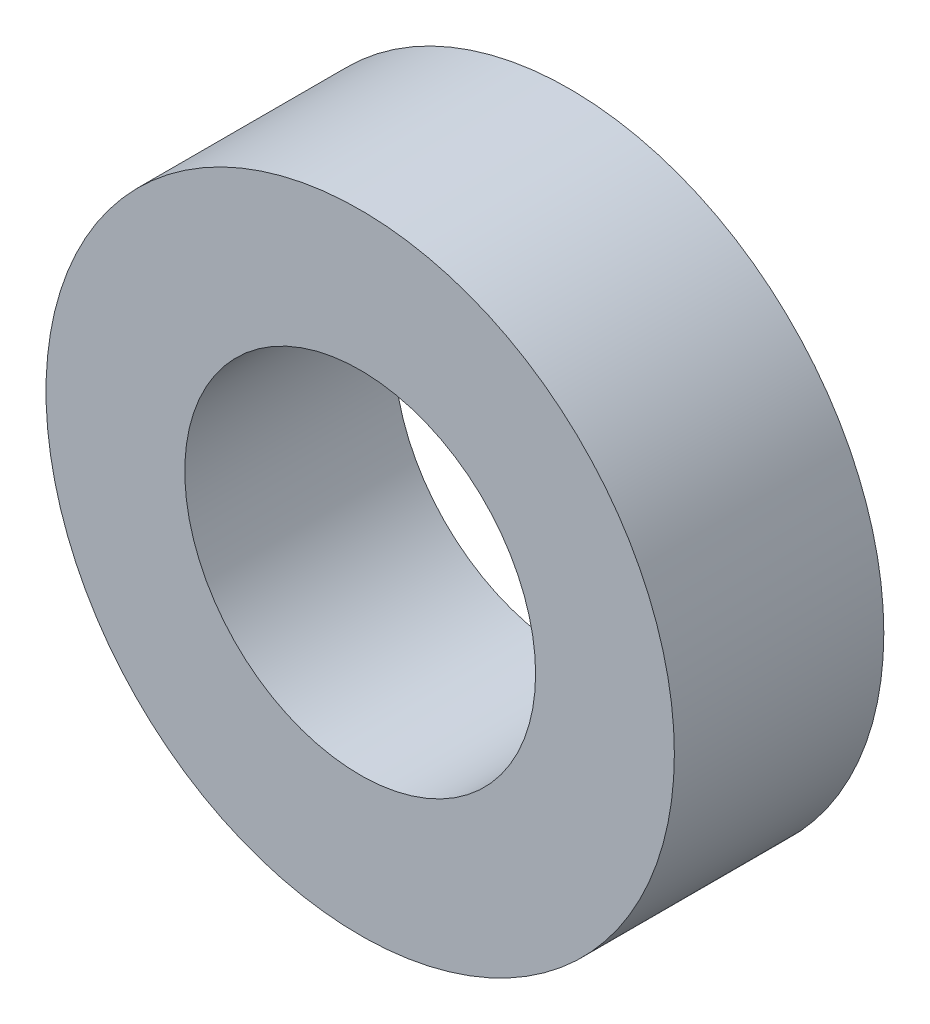
ISO-10303-21;
HEADER;
FILE_DESCRIPTION(('STEP AP214'),'2;1');
FILE_NAME('part.step','',(''),(''),'','','');
FILE_SCHEMA(('AUTOMOTIVE_DESIGN { 1 0 10303 214 1 1 1 1 }'));
ENDSEC;
DATA;
#1=APPLICATION_CONTEXT('core data for automotive mechanical design processes');
#2=APPLICATION_PROTOCOL_DEFINITION('international standard','automotive_design',2000,#1);
#3=PRODUCT_CONTEXT('',#1,'mechanical');
#4=PRODUCT('Part','Part','',(#3));
#5=PRODUCT_RELATED_PRODUCT_CATEGORY('part','',(#4));
#6=PRODUCT_DEFINITION_FORMATION('','',#4);
#7=PRODUCT_DEFINITION_CONTEXT('part definition',#1,'design');
#8=PRODUCT_DEFINITION('design','',#6,#7);
#9=PRODUCT_DEFINITION_SHAPE('','',#8);
#10=(LENGTH_UNIT() NAMED_UNIT(*) SI_UNIT(.MILLI.,.METRE.));
#11=(NAMED_UNIT(*) PLANE_ANGLE_UNIT() SI_UNIT($,.RADIAN.));
#12=(NAMED_UNIT(*) SI_UNIT($,.STERADIAN.) SOLID_ANGLE_UNIT());
#13=UNCERTAINTY_MEASURE_WITH_UNIT(LENGTH_MEASURE(1.E-05),#10,'distance_accuracy_value','');
#14=(GEOMETRIC_REPRESENTATION_CONTEXT(3) GLOBAL_UNCERTAINTY_ASSIGNED_CONTEXT((#13)) GLOBAL_UNIT_ASSIGNED_CONTEXT((#10,
#11,#12)) REPRESENTATION_CONTEXT('',''));
#15=CARTESIAN_POINT('',(0.,0.,0.));
#16=DIRECTION('',(0.,0.,1.));
#17=DIRECTION('',(1.,0.,0.));
#18=AXIS2_PLACEMENT_3D('',#15,#16,#17);
#19=CARTESIAN_POINT('',(0.,0.,2.));
#20=DIRECTION('',(0.,0.,1.));
#21=DIRECTION('',(1.,0.,0.));
#22=AXIS2_PLACEMENT_3D('',#19,#20,#21);
#23=PLANE('',#22);
#24=CARTESIAN_POINT('',(0.,0.,2.));
#25=DIRECTION('',(0.,0.,1.));
#26=DIRECTION('',(1.,0.,0.));
#27=AXIS2_PLACEMENT_3D('',#24,#25,#26);
#28=CIRCLE('',#27,3.);
#29=CARTESIAN_POINT('',(3.,0.,2.));
#30=VERTEX_POINT('',#29);
#31=EDGE_CURVE('E10',#30,#30,#28,.T.);
#32=ORIENTED_EDGE('',*,*,#31,.T.);
#33=EDGE_LOOP('',(#32));
#34=FACE_BOUND('',#33,.T.);
#35=CARTESIAN_POINT('',(0.,0.,2.));
#36=DIRECTION('',(0.,0.,1.));
#37=DIRECTION('',(1.,0.,0.));
#38=AXIS2_PLACEMENT_3D('',#35,#36,#37);
#39=CIRCLE('',#38,1.675);
#40=CARTESIAN_POINT('',(1.675,0.,2.));
#41=VERTEX_POINT('',#40);
#42=EDGE_CURVE('E56',#41,#41,#39,.T.);
#43=ORIENTED_EDGE('',*,*,#42,.F.);
#44=EDGE_LOOP('',(#43));
#45=FACE_BOUND('',#44,.T.);
#46=ADVANCED_FACE('F43',(#34,#45),#23,.T.);
#47=CARTESIAN_POINT('',(0.,0.,0.));
#48=DIRECTION('',(0.,0.,1.));
#49=DIRECTION('',(1.,0.,0.));
#50=AXIS2_PLACEMENT_3D('',#47,#48,#49);
#51=PLANE('',#50);
#52=CARTESIAN_POINT('',(0.,0.,0.));
#53=DIRECTION('',(0.,0.,1.));
#54=DIRECTION('',(1.,0.,0.));
#55=AXIS2_PLACEMENT_3D('',#52,#53,#54);
#56=CIRCLE('',#55,3.);
#57=CARTESIAN_POINT('',(3.,0.,0.));
#58=VERTEX_POINT('',#57);
#59=EDGE_CURVE('E47',#58,#58,#56,.T.);
#60=ORIENTED_EDGE('',*,*,#59,.F.);
#61=EDGE_LOOP('',(#60));
#62=FACE_BOUND('',#61,.T.);
#63=CARTESIAN_POINT('',(0.,0.,0.));
#64=DIRECTION('',(0.,0.,1.));
#65=DIRECTION('',(1.,0.,0.));
#66=AXIS2_PLACEMENT_3D('',#63,#64,#65);
#67=CIRCLE('',#66,1.675);
#68=CARTESIAN_POINT('',(1.675,0.,0.));
#69=VERTEX_POINT('',#68);
#70=EDGE_CURVE('E58',#69,#69,#67,.T.);
#71=ORIENTED_EDGE('',*,*,#70,.T.);
#72=EDGE_LOOP('',(#71));
#73=FACE_BOUND('',#72,.T.);
#74=ADVANCED_FACE('F70',(#62,#73),#51,.F.);
#75=CARTESIAN_POINT('',(0.,0.,2.));
#76=DIRECTION('',(0.,0.,-1.));
#77=DIRECTION('',(-1.,0.,0.));
#78=AXIS2_PLACEMENT_3D('',#75,#76,#77);
#79=CYLINDRICAL_SURFACE('',#78,3.);
#80=ORIENTED_EDGE('',*,*,#31,.F.);
#81=EDGE_LOOP('',(#80));
#82=FACE_BOUND('',#81,.T.);
#83=ORIENTED_EDGE('',*,*,#59,.T.);
#84=EDGE_LOOP('',(#83));
#85=FACE_BOUND('',#84,.T.);
#86=ADVANCED_FACE('F45',(#82,#85),#79,.T.);
#87=CARTESIAN_POINT('',(0.,0.,2.));
#88=DIRECTION('',(0.,0.,-1.));
#89=DIRECTION('',(-1.,0.,0.));
#90=AXIS2_PLACEMENT_3D('',#87,#88,#89);
#91=CYLINDRICAL_SURFACE('',#90,1.675);
#92=ORIENTED_EDGE('',*,*,#42,.T.);
#93=EDGE_LOOP('',(#92));
#94=FACE_BOUND('',#93,.T.);
#95=ORIENTED_EDGE('',*,*,#70,.F.);
#96=EDGE_LOOP('',(#95));
#97=FACE_BOUND('',#96,.T.);
#98=ADVANCED_FACE('F66',(#94,#97),#91,.F.);
#99=CLOSED_SHELL('',(#46,#74,#86,#98));
#100=MANIFOLD_SOLID_BREP('B2',#99);
#101=ADVANCED_BREP_SHAPE_REPRESENTATION('',(#18,#100),#14);
#102=SHAPE_DEFINITION_REPRESENTATION(#9,#101);
ENDSEC;
END-ISO-10303-21;
